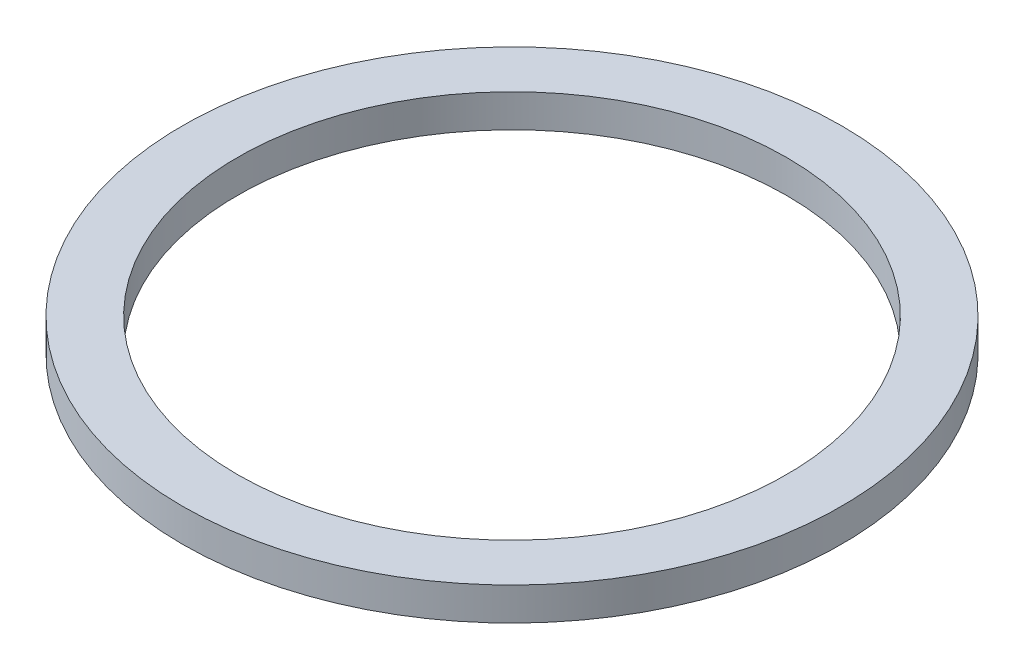
ISO-10303-21;
HEADER;
FILE_DESCRIPTION(('STEP AP214'),'2;1');
FILE_NAME('part.step','',(''),(''),'','','');
FILE_SCHEMA(('AUTOMOTIVE_DESIGN { 1 0 10303 214 1 1 1 1 }'));
ENDSEC;
DATA;
#1=APPLICATION_CONTEXT('core data for automotive mechanical design processes');
#2=APPLICATION_PROTOCOL_DEFINITION('international standard','automotive_design',2000,#1);
#3=PRODUCT_CONTEXT('',#1,'mechanical');
#4=PRODUCT('Part','Part','',(#3));
#5=PRODUCT_RELATED_PRODUCT_CATEGORY('part','',(#4));
#6=PRODUCT_DEFINITION_FORMATION('','',#4);
#7=PRODUCT_DEFINITION_CONTEXT('part definition',#1,'design');
#8=PRODUCT_DEFINITION('design','',#6,#7);
#9=PRODUCT_DEFINITION_SHAPE('','',#8);
#10=(LENGTH_UNIT() NAMED_UNIT(*) SI_UNIT(.MILLI.,.METRE.));
#11=(NAMED_UNIT(*) PLANE_ANGLE_UNIT() SI_UNIT($,.RADIAN.));
#12=(NAMED_UNIT(*) SI_UNIT($,.STERADIAN.) SOLID_ANGLE_UNIT());
#13=UNCERTAINTY_MEASURE_WITH_UNIT(LENGTH_MEASURE(1.E-05),#10,'distance_accuracy_value','');
#14=(GEOMETRIC_REPRESENTATION_CONTEXT(3) GLOBAL_UNCERTAINTY_ASSIGNED_CONTEXT((#13)) GLOBAL_UNIT_ASSIGNED_CONTEXT((#10,
#11,#12)) REPRESENTATION_CONTEXT('',''));
#15=CARTESIAN_POINT('',(0.,0.,0.));
#16=DIRECTION('',(0.,0.,1.));
#17=DIRECTION('',(1.,0.,0.));
#18=AXIS2_PLACEMENT_3D('',#15,#16,#17);
#19=CARTESIAN_POINT('',(0.,3.,0.));
#20=DIRECTION('',(0.,1.,0.));
#21=DIRECTION('',(0.,0.,1.));
#22=AXIS2_PLACEMENT_3D('',#19,#20,#21);
#23=PLANE('',#22);
#24=CARTESIAN_POINT('',(0.,3.,0.));
#25=DIRECTION('',(0.,1.,0.));
#26=DIRECTION('',(0.,0.,1.));
#27=AXIS2_PLACEMENT_3D('',#24,#25,#26);
#28=CIRCLE('',#27,30.);
#29=CARTESIAN_POINT('',(0.,3.,30.));
#30=VERTEX_POINT('',#29);
#31=EDGE_CURVE('E10',#30,#30,#28,.T.);
#32=ORIENTED_EDGE('',*,*,#31,.T.);
#33=EDGE_LOOP('',(#32));
#34=FACE_BOUND('',#33,.T.);
#35=CARTESIAN_POINT('',(0.,3.,0.));
#36=DIRECTION('',(0.,1.,0.));
#37=DIRECTION('',(0.,0.,1.));
#38=AXIS2_PLACEMENT_3D('',#35,#36,#37);
#39=CIRCLE('',#38,25.);
#40=CARTESIAN_POINT('',(0.,3.,25.));
#41=VERTEX_POINT('',#40);
#42=EDGE_CURVE('E48',#41,#41,#39,.T.);
#43=ORIENTED_EDGE('',*,*,#42,.F.);
#44=EDGE_LOOP('',(#43));
#45=FACE_BOUND('',#44,.T.);
#46=ADVANCED_FACE('F37',(#34,#45),#23,.T.);
#47=CARTESIAN_POINT('',(0.,0.,0.));
#48=DIRECTION('',(0.,1.,0.));
#49=DIRECTION('',(0.,0.,1.));
#50=AXIS2_PLACEMENT_3D('',#47,#48,#49);
#51=PLANE('',#50);
#52=CARTESIAN_POINT('',(0.,0.,0.));
#53=DIRECTION('',(0.,1.,0.));
#54=DIRECTION('',(0.,0.,1.));
#55=AXIS2_PLACEMENT_3D('',#52,#53,#54);
#56=CIRCLE('',#55,30.);
#57=CARTESIAN_POINT('',(0.,0.,30.));
#58=VERTEX_POINT('',#57);
#59=EDGE_CURVE('E41',#58,#58,#56,.T.);
#60=ORIENTED_EDGE('',*,*,#59,.F.);
#61=EDGE_LOOP('',(#60));
#62=FACE_BOUND('',#61,.T.);
#63=CARTESIAN_POINT('',(0.,0.,0.));
#64=DIRECTION('',(0.,1.,0.));
#65=DIRECTION('',(0.,0.,1.));
#66=AXIS2_PLACEMENT_3D('',#63,#64,#65);
#67=CIRCLE('',#66,25.);
#68=CARTESIAN_POINT('',(0.,0.,25.));
#69=VERTEX_POINT('',#68);
#70=EDGE_CURVE('E50',#69,#69,#67,.T.);
#71=ORIENTED_EDGE('',*,*,#70,.T.);
#72=EDGE_LOOP('',(#71));
#73=FACE_BOUND('',#72,.T.);
#74=ADVANCED_FACE('F60',(#62,#73),#51,.F.);
#75=CARTESIAN_POINT('',(0.,3.,0.));
#76=DIRECTION('',(0.,-1.,0.));
#77=DIRECTION('',(0.,0.,-1.));
#78=AXIS2_PLACEMENT_3D('',#75,#76,#77);
#79=CYLINDRICAL_SURFACE('',#78,30.);
#80=ORIENTED_EDGE('',*,*,#31,.F.);
#81=EDGE_LOOP('',(#80));
#82=FACE_BOUND('',#81,.T.);
#83=ORIENTED_EDGE('',*,*,#59,.T.);
#84=EDGE_LOOP('',(#83));
#85=FACE_BOUND('',#84,.T.);
#86=ADVANCED_FACE('F39',(#82,#85),#79,.T.);
#87=CARTESIAN_POINT('',(0.,3.,0.));
#88=DIRECTION('',(0.,-1.,0.));
#89=DIRECTION('',(0.,0.,-1.));
#90=AXIS2_PLACEMENT_3D('',#87,#88,#89);
#91=CYLINDRICAL_SURFACE('',#90,25.);
#92=ORIENTED_EDGE('',*,*,#42,.T.);
#93=EDGE_LOOP('',(#92));
#94=FACE_BOUND('',#93,.T.);
#95=ORIENTED_EDGE('',*,*,#70,.F.);
#96=EDGE_LOOP('',(#95));
#97=FACE_BOUND('',#96,.T.);
#98=ADVANCED_FACE('F56',(#94,#97),#91,.F.);
#99=CLOSED_SHELL('',(#46,#74,#86,#98));
#100=MANIFOLD_SOLID_BREP('B2',#99);
#101=ADVANCED_BREP_SHAPE_REPRESENTATION('',(#18,#100),#14);
#102=SHAPE_DEFINITION_REPRESENTATION(#9,#101);
ENDSEC;
END-ISO-10303-21;
